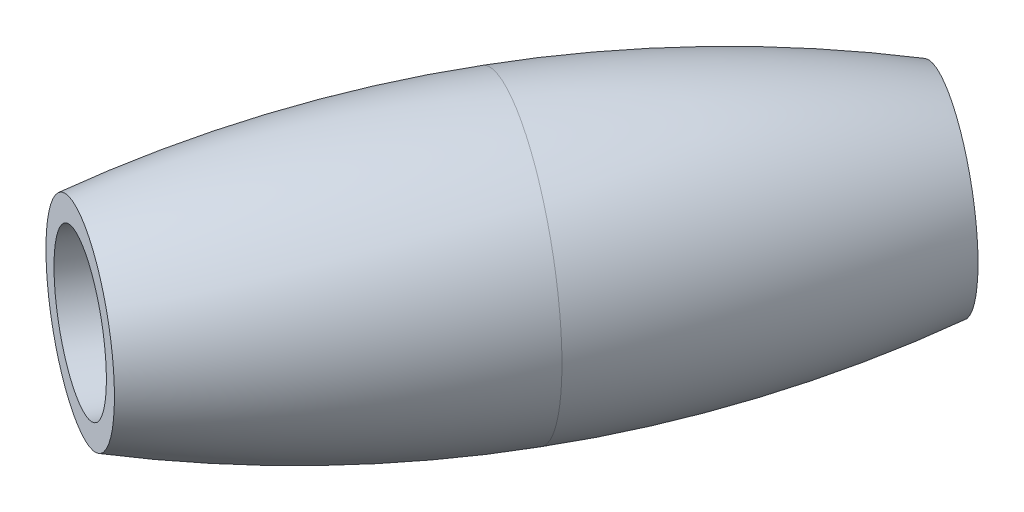
ISO-10303-21;
HEADER;
FILE_DESCRIPTION(('STEP AP214'),'2;1');
FILE_NAME('part.step','',(''),(''),'','','');
FILE_SCHEMA(('AUTOMOTIVE_DESIGN { 1 0 10303 214 1 1 1 1 }'));
ENDSEC;
DATA;
#1=APPLICATION_CONTEXT('core data for automotive mechanical design processes');
#2=APPLICATION_PROTOCOL_DEFINITION('international standard','automotive_design',2000,#1);
#3=PRODUCT_CONTEXT('',#1,'mechanical');
#4=PRODUCT('Part','Part','',(#3));
#5=PRODUCT_RELATED_PRODUCT_CATEGORY('part','',(#4));
#6=PRODUCT_DEFINITION_FORMATION('','',#4);
#7=PRODUCT_DEFINITION_CONTEXT('part definition',#1,'design');
#8=PRODUCT_DEFINITION('design','',#6,#7);
#9=PRODUCT_DEFINITION_SHAPE('','',#8);
#10=(LENGTH_UNIT() NAMED_UNIT(*) SI_UNIT(.MILLI.,.METRE.));
#11=(NAMED_UNIT(*) PLANE_ANGLE_UNIT() SI_UNIT($,.RADIAN.));
#12=(NAMED_UNIT(*) SI_UNIT($,.STERADIAN.) SOLID_ANGLE_UNIT());
#13=UNCERTAINTY_MEASURE_WITH_UNIT(LENGTH_MEASURE(1.E-05),#10,'distance_accuracy_value','');
#14=(GEOMETRIC_REPRESENTATION_CONTEXT(3) GLOBAL_UNCERTAINTY_ASSIGNED_CONTEXT((#13)) GLOBAL_UNIT_ASSIGNED_CONTEXT((#10,
#11,#12)) REPRESENTATION_CONTEXT('',''));
#15=CARTESIAN_POINT('',(0.,0.,0.));
#16=DIRECTION('',(0.,0.,1.));
#17=DIRECTION('',(1.,0.,0.));
#18=AXIS2_PLACEMENT_3D('',#15,#16,#17);
#19=CARTESIAN_POINT('',(21.2203993176409,0.,21.2007398022978));
#20=DIRECTION('',(-0.5,0.,0.866025403784439));
#21=DIRECTION('',(0.866025403784439,0.,0.5));
#22=AXIS2_PLACEMENT_3D('',#19,#20,#21);
#23=DEGENERATE_TOROIDAL_SURFACE('',#22,62.214645324409,70.3146467972385,.F.);
#24=CARTESIAN_POINT('',(21.2132034355998,0.,21.2132034355981));
#25=DIRECTION('',(-0.5,0.,0.866025403784439));
#26=DIRECTION('',(0.866025403784439,0.,0.5));
#27=AXIS2_PLACEMENT_3D('',#24,#25,#26);
#28=CIRCLE('',#27,8.10000000000071);
#29=CARTESIAN_POINT('',(28.2280092062544,0.,25.2632034355985));
#30=VERTEX_POINT('',#29);
#31=EDGE_CURVE('E10',#30,#30,#28,.T.);
#32=ORIENTED_EDGE('',*,*,#31,.T.);
#33=EDGE_LOOP('',(#32));
#34=FACE_BOUND('',#33,.T.);
#35=CARTESIAN_POINT('',(11.8382034356139,0.,37.451179756532));
#36=DIRECTION('',(-0.5,0.,0.866025403784439));
#37=DIRECTION('',(0.866025403784439,0.,0.5));
#38=AXIS2_PLACEMENT_3D('',#35,#36,#37);
#39=CIRCLE('',#38,5.55000000001854);
#40=CARTESIAN_POINT('',(16.6446444266336,0.,40.2261797565413));
#41=VERTEX_POINT('',#40);
#42=EDGE_CURVE('E51',#41,#41,#39,.T.);
#43=ORIENTED_EDGE('',*,*,#42,.F.);
#44=EDGE_LOOP('',(#43));
#45=FACE_BOUND('',#44,.T.);
#46=ADVANCED_FACE('F32',(#34,#45),#23,.F.);
#47=CARTESIAN_POINT('',(21.2060075535052,0.,21.2256670689913));
#48=DIRECTION('',(-0.5,0.,0.866025403784439));
#49=DIRECTION('',(0.866025403784439,0.,0.5));
#50=AXIS2_PLACEMENT_3D('',#47,#48,#49);
#51=DEGENERATE_TOROIDAL_SURFACE('',#50,62.2146453239034,70.3146467967329,.F.);
#52=CARTESIAN_POINT('',(30.5882034355888,0.,4.97522711465908));
#53=DIRECTION('',(-0.5,0.,0.866025403784439));
#54=DIRECTION('',(0.866025403784439,0.,0.5));
#55=AXIS2_PLACEMENT_3D('',#52,#53,#54);
#56=CIRCLE('',#55,5.5499999999682);
#57=CARTESIAN_POINT('',(35.3946444265649,0.,7.75022711464318));
#58=VERTEX_POINT('',#57);
#59=EDGE_CURVE('E38',#58,#58,#56,.T.);
#60=ORIENTED_EDGE('',*,*,#59,.T.);
#61=EDGE_LOOP('',(#60));
#62=FACE_BOUND('',#61,.T.);
#63=ORIENTED_EDGE('',*,*,#31,.F.);
#64=EDGE_LOOP('',(#63));
#65=FACE_BOUND('',#64,.T.);
#66=ADVANCED_FACE('F59',(#62,#65),#51,.F.);
#67=CARTESIAN_POINT('',(35.3946444265649,0.,7.75022711464318));
#68=DIRECTION('',(0.5,0.,-0.866025403784439));
#69=DIRECTION('',(-0.866025403784439,0.,-0.5));
#70=AXIS2_PLACEMENT_3D('',#67,#68,#69);
#71=PLANE('',#70);
#72=CARTESIAN_POINT('',(30.5882034355888,0.,4.97522711465908));
#73=DIRECTION('',(-0.5,0.,0.866025403784439));
#74=DIRECTION('',(0.866025403784439,0.,0.5));
#75=AXIS2_PLACEMENT_3D('',#72,#73,#74);
#76=CIRCLE('',#75,4.24500000002058);
#77=CARTESIAN_POINT('',(34.2644812746715,0.,7.09772711466937));
#78=VERTEX_POINT('',#77);
#79=EDGE_CURVE('E42',#78,#78,#76,.T.);
#80=ORIENTED_EDGE('',*,*,#79,.T.);
#81=EDGE_LOOP('',(#80));
#82=FACE_BOUND('',#81,.T.);
#83=ORIENTED_EDGE('',*,*,#59,.F.);
#84=EDGE_LOOP('',(#83));
#85=FACE_BOUND('',#84,.T.);
#86=ADVANCED_FACE('F63',(#82,#85),#71,.T.);
#87=CARTESIAN_POINT('',(25.9007034355833,0.,13.0942152751477));
#88=DIRECTION('',(-0.5,0.,0.866025403784439));
#89=DIRECTION('',(0.866025403784439,0.,0.5));
#90=AXIS2_PLACEMENT_3D('',#87,#88,#89);
#91=CYLINDRICAL_SURFACE('',#90,4.24500000002058);
#92=CARTESIAN_POINT('',(11.8382034356139,0.,37.451179756532));
#93=DIRECTION('',(-0.5,0.,0.866025403784439));
#94=DIRECTION('',(0.866025403784439,0.,0.5));
#95=AXIS2_PLACEMENT_3D('',#92,#93,#94);
#96=CIRCLE('',#95,4.24500000002058);
#97=CARTESIAN_POINT('',(15.5144812746967,0.,39.5736797565423));
#98=VERTEX_POINT('',#97);
#99=EDGE_CURVE('E46',#98,#98,#96,.T.);
#100=ORIENTED_EDGE('',*,*,#99,.T.);
#101=EDGE_LOOP('',(#100));
#102=FACE_BOUND('',#101,.T.);
#103=ORIENTED_EDGE('',*,*,#79,.F.);
#104=EDGE_LOOP('',(#103));
#105=FACE_BOUND('',#104,.T.);
#106=ADVANCED_FACE('F67',(#102,#105),#91,.F.);
#107=CARTESIAN_POINT('',(15.5144812746967,0.,39.5736797565423));
#108=DIRECTION('',(-0.5,0.,0.866025403784439));
#109=DIRECTION('',(0.866025403784439,0.,0.5));
#110=AXIS2_PLACEMENT_3D('',#107,#108,#109);
#111=PLANE('',#110);
#112=ORIENTED_EDGE('',*,*,#42,.T.);
#113=EDGE_LOOP('',(#112));
#114=FACE_BOUND('',#113,.T.);
#115=ORIENTED_EDGE('',*,*,#99,.F.);
#116=EDGE_LOOP('',(#115));
#117=FACE_BOUND('',#116,.T.);
#118=ADVANCED_FACE('F55',(#114,#117),#111,.T.);
#119=CLOSED_SHELL('',(#46,#66,#86,#106,#118));
#120=MANIFOLD_SOLID_BREP('B2',#119);
#121=ADVANCED_BREP_SHAPE_REPRESENTATION('',(#18,#120),#14);
#122=SHAPE_DEFINITION_REPRESENTATION(#9,#121);
ENDSEC;
END-ISO-10303-21;
